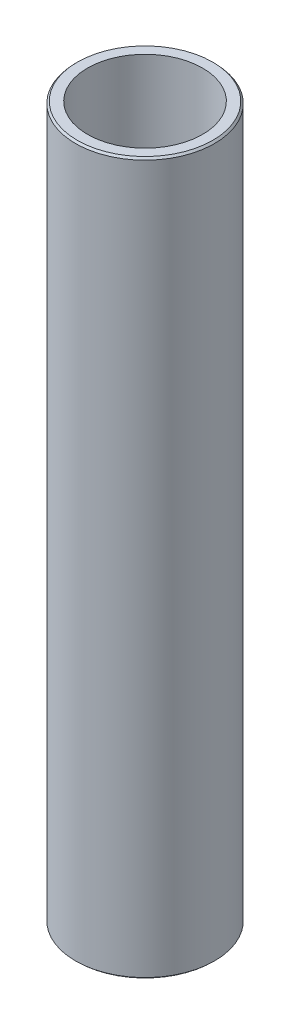
ISO-10303-21;
HEADER;
FILE_DESCRIPTION(('STEP AP214'),'2;1');
FILE_NAME('part.step','',(''),(''),'','','');
FILE_SCHEMA(('AUTOMOTIVE_DESIGN { 1 0 10303 214 1 1 1 1 }'));
ENDSEC;
DATA;
#1=APPLICATION_CONTEXT('core data for automotive mechanical design processes');
#2=APPLICATION_PROTOCOL_DEFINITION('international standard','automotive_design',2000,#1);
#3=PRODUCT_CONTEXT('',#1,'mechanical');
#4=PRODUCT('Part','Part','',(#3));
#5=PRODUCT_RELATED_PRODUCT_CATEGORY('part','',(#4));
#6=PRODUCT_DEFINITION_FORMATION('','',#4);
#7=PRODUCT_DEFINITION_CONTEXT('part definition',#1,'design');
#8=PRODUCT_DEFINITION('design','',#6,#7);
#9=PRODUCT_DEFINITION_SHAPE('','',#8);
#10=(LENGTH_UNIT() NAMED_UNIT(*) SI_UNIT(.MILLI.,.METRE.));
#11=(NAMED_UNIT(*) PLANE_ANGLE_UNIT() SI_UNIT($,.RADIAN.));
#12=(NAMED_UNIT(*) SI_UNIT($,.STERADIAN.) SOLID_ANGLE_UNIT());
#13=UNCERTAINTY_MEASURE_WITH_UNIT(LENGTH_MEASURE(1.E-05),#10,'distance_accuracy_value','');
#14=(GEOMETRIC_REPRESENTATION_CONTEXT(3) GLOBAL_UNCERTAINTY_ASSIGNED_CONTEXT((#13)) GLOBAL_UNIT_ASSIGNED_CONTEXT((#10,
#11,#12)) REPRESENTATION_CONTEXT('',''));
#15=CARTESIAN_POINT('',(0.,0.,0.));
#16=DIRECTION('',(0.,0.,1.));
#17=DIRECTION('',(1.,0.,0.));
#18=AXIS2_PLACEMENT_3D('',#15,#16,#17);
#19=CARTESIAN_POINT('',(0.,563.064663054393,0.));
#20=DIRECTION('',(0.,-1.,0.));
#21=DIRECTION('',(0.,0.,-1.));
#22=AXIS2_PLACEMENT_3D('',#19,#20,#21);
#23=CYLINDRICAL_SURFACE('',#22,55.);
#24=CARTESIAN_POINT('',(0.,561.534398512626,0.));
#25=DIRECTION('',(0.,1.,0.));
#26=DIRECTION('',(0.,0.,1.));
#27=AXIS2_PLACEMENT_3D('',#24,#25,#26);
#28=CIRCLE('',#27,55.);
#29=CARTESIAN_POINT('',(0.,561.534398512626,-55.));
#30=VERTEX_POINT('',#29);
#31=EDGE_CURVE('E50',#30,#30,#28,.F.);
#32=CARTESIAN_POINT('',(0.,1.38551752652205,0.));
#33=DIRECTION('',(0.,1.,0.));
#34=DIRECTION('',(0.,0.,1.));
#35=AXIS2_PLACEMENT_3D('',#32,#33,#34);
#36=CIRCLE('',#35,55.);
#37=CARTESIAN_POINT('',(0.,1.38551752652194,-55.));
#38=VERTEX_POINT('',#37);
#39=EDGE_CURVE('E51',#38,#38,#36,.T.);
#40=CARTESIAN_POINT('',(0.,561.534398512626,-55.));
#41=CARTESIAN_POINT('',(0.,555.699514335688,-55.));
#42=CARTESIAN_POINT('',(0.,549.864630158749,-55.));
#43=CARTESIAN_POINT('',(0.,538.194861804872,-55.));
#44=CARTESIAN_POINT('',(0.,532.359977627933,-55.));
#45=CARTESIAN_POINT('',(0.,520.690209274056,-55.));
#46=CARTESIAN_POINT('',(0.,514.855325097118,-55.));
#47=CARTESIAN_POINT('',(0.,503.185556743241,-55.));
#48=CARTESIAN_POINT('',(0.,497.350672566302,-55.));
#49=CARTESIAN_POINT('',(0.,485.680904212425,-55.));
#50=CARTESIAN_POINT('',(0.,479.846020035486,-55.));
#51=CARTESIAN_POINT('',(0.,468.176251681609,-55.));
#52=CARTESIAN_POINT('',(0.,462.34136750467,-55.));
#53=CARTESIAN_POINT('',(0.,450.671599150793,-55.));
#54=CARTESIAN_POINT('',(0.,444.836714973855,-55.));
#55=CARTESIAN_POINT('',(0.,433.166946619977,-55.));
#56=CARTESIAN_POINT('',(0.,427.332062443039,-55.));
#57=CARTESIAN_POINT('',(0.,415.662294089162,-55.));
#58=CARTESIAN_POINT('',(0.,409.827409912223,-55.));
#59=CARTESIAN_POINT('',(0.,398.157641558346,-55.));
#60=CARTESIAN_POINT('',(0.,392.322757381407,-55.));
#61=CARTESIAN_POINT('',(0.,380.65298902753,-55.));
#62=CARTESIAN_POINT('',(0.,374.818104850592,-55.));
#63=CARTESIAN_POINT('',(0.,363.148336496714,-55.));
#64=CARTESIAN_POINT('',(0.,357.313452319776,-55.));
#65=CARTESIAN_POINT('',(0.,345.643683965899,-55.));
#66=CARTESIAN_POINT('',(0.,339.80879978896,-55.));
#67=CARTESIAN_POINT('',(0.,328.139031435083,-55.));
#68=CARTESIAN_POINT('',(0.,322.304147258144,-55.));
#69=CARTESIAN_POINT('',(0.,310.634378904267,-55.));
#70=CARTESIAN_POINT('',(0.,304.799494727329,-55.));
#71=CARTESIAN_POINT('',(0.,293.129726373451,-55.));
#72=CARTESIAN_POINT('',(0.,287.294842196513,-55.));
#73=CARTESIAN_POINT('',(0.,275.625073842636,-55.));
#74=CARTESIAN_POINT('',(0.,269.790189665697,-55.));
#75=CARTESIAN_POINT('',(0.,258.12042131182,-55.));
#76=CARTESIAN_POINT('',(0.,252.285537134881,-55.));
#77=CARTESIAN_POINT('',(0.,240.615768781004,-55.));
#78=CARTESIAN_POINT('',(0.,234.780884604065,-55.));
#79=CARTESIAN_POINT('',(0.,223.111116250188,-55.));
#80=CARTESIAN_POINT('',(0.,217.27623207325,-55.));
#81=CARTESIAN_POINT('',(0.,205.606463719373,-55.));
#82=CARTESIAN_POINT('',(0.,199.771579542434,-55.));
#83=CARTESIAN_POINT('',(0.,188.101811188557,-55.));
#84=CARTESIAN_POINT('',(0.,182.266927011618,-55.));
#85=CARTESIAN_POINT('',(0.,170.597158657741,-55.));
#86=CARTESIAN_POINT('',(0.,164.762274480802,-55.));
#87=CARTESIAN_POINT('',(0.,153.092506126925,-55.));
#88=CARTESIAN_POINT('',(0.,147.257621949987,-55.));
#89=CARTESIAN_POINT('',(0.,135.587853596109,-55.));
#90=CARTESIAN_POINT('',(0.,129.752969419171,-55.));
#91=CARTESIAN_POINT('',(0.,118.083201065294,-55.));
#92=CARTESIAN_POINT('',(0.,112.248316888355,-55.));
#93=CARTESIAN_POINT('',(0.,100.578548534478,-55.));
#94=CARTESIAN_POINT('',(0.,94.7436643575393,-55.));
#95=CARTESIAN_POINT('',(0.,83.0738960036622,-55.));
#96=CARTESIAN_POINT('',(0.,77.2390118267236,-55.));
#97=CARTESIAN_POINT('',(0.,65.5692434728464,-55.));
#98=CARTESIAN_POINT('',(0.,59.7343592959078,-55.));
#99=CARTESIAN_POINT('',(0.,48.0645909420306,-55.));
#100=CARTESIAN_POINT('',(0.,42.2297067650921,-55.));
#101=CARTESIAN_POINT('',(0.,30.5599384112149,-55.));
#102=CARTESIAN_POINT('',(0.,24.7250542342763,-55.));
#103=CARTESIAN_POINT('',(0.,13.0552858803991,-55.));
#104=CARTESIAN_POINT('',(0.,7.22040170346054,-55.));
#105=CARTESIAN_POINT('',(0.,1.38551752652194,-55.));
#106=B_SPLINE_CURVE_WITH_KNOTS('',3,(#40,#41,#42,#43,#44,#45,#46,#47,#48,#49,#50,#51,#52,#53,
#54,#55,#56,#57,#58,#59,#60,#61,#62,#63,#64,#65,#66,#67,#68,#69,#70,#71,#72,#73,#74,#75,#76,#77,
#78,#79,#80,#81,#82,#83,#84,#85,#86,#87,#88,#89,#90,#91,#92,#93,#94,#95,#96,#97,#98,#99,#100,
#101,#102,#103,#104,#105),.UNSPECIFIED.,.F.,.F.,(4,2,2,2,2,2,2,2,2,2,2,2,2,2,2,2,2,2,2,2,2,2,2,
2,2,2,2,2,2,2,2,2,4),(0.,17.5046525308157,35.0093050616315,52.5139575924473,70.018610123263,
87.5232626540787,105.027915184895,122.53256771571,140.037220246526,157.541872777342,
175.046525308158,192.551177838973,210.055830369789,227.560482900605,245.065135431421,
262.569787962236,280.074440493052,297.579093023868,315.083745554684,332.588398085499,
350.093050616315,367.597703147131,385.102355677947,402.607008208763,420.111660739578,
437.616313270394,455.12096580121,472.625618332026,490.130270862841,507.634923393657,
525.139575924473,542.644228455289,560.148880986104),.UNSPECIFIED.);
#107=EDGE_CURVE('BSEAM39',#30,#38,#106,.T.);
#108=ORIENTED_EDGE('',*,*,#31,.T.);
#109=ORIENTED_EDGE('',*,*,#39,.T.);
#110=ORIENTED_EDGE('',*,*,#107,.T.);
#111=ORIENTED_EDGE('',*,*,#107,.F.);
#112=EDGE_LOOP('',(#108,#110,#109,#111));
#113=FACE_BOUND('',#112,.T.);
#114=ADVANCED_FACE('F39',(#113),#23,.T.);
#115=CARTESIAN_POINT('',(0.,563.064663054393,0.));
#116=DIRECTION('',(0.,1.,0.));
#117=DIRECTION('',(0.,0.,1.));
#118=AXIS2_PLACEMENT_3D('',#115,#116,#117);
#119=PLANE('',#118);
#120=CARTESIAN_POINT('',(0.,563.064663054393,0.));
#121=DIRECTION('',(0.,1.,0.));
#122=DIRECTION('',(0.,0.,1.));
#123=AXIS2_PLACEMENT_3D('',#120,#121,#122);
#124=CIRCLE('',#123,53.6144824734787);
#125=CARTESIAN_POINT('',(0.,563.064663054393,53.6144824734787));
#126=VERTEX_POINT('',#125);
#127=EDGE_CURVE('E54',#126,#126,#124,.T.);
#128=ORIENTED_EDGE('',*,*,#127,.T.);
#129=EDGE_LOOP('',(#128));
#130=FACE_BOUND('',#129,.T.);
#131=CARTESIAN_POINT('',(0.,563.064663054393,0.));
#132=DIRECTION('',(0.,1.,0.));
#133=DIRECTION('',(0.,0.,1.));
#134=AXIS2_PLACEMENT_3D('',#131,#132,#133);
#135=CIRCLE('',#134,45.524548650965);
#136=CARTESIAN_POINT('',(0.,563.064663054393,-45.524548650965));
#137=VERTEX_POINT('',#136);
#138=EDGE_CURVE('E58',#137,#137,#135,.T.);
#139=ORIENTED_EDGE('',*,*,#138,.F.);
#140=EDGE_LOOP('',(#139));
#141=FACE_BOUND('',#140,.T.);
#142=ADVANCED_FACE('F69',(#130,#141),#119,.T.);
#143=CARTESIAN_POINT('',(0.,0.,0.));
#144=DIRECTION('',(0.,1.,0.));
#145=DIRECTION('',(0.,0.,1.));
#146=AXIS2_PLACEMENT_3D('',#143,#144,#145);
#147=PLANE('',#146);
#148=CARTESIAN_POINT('',(0.,0.,0.));
#149=DIRECTION('',(0.,1.,0.));
#150=DIRECTION('',(0.,0.,1.));
#151=AXIS2_PLACEMENT_3D('',#148,#149,#150);
#152=CIRCLE('',#151,53.4697354582327);
#153=CARTESIAN_POINT('',(0.,0.,53.4697354582327));
#154=VERTEX_POINT('',#153);
#155=EDGE_CURVE('E10',#154,#154,#152,.F.);
#156=ORIENTED_EDGE('',*,*,#155,.T.);
#157=EDGE_LOOP('',(#156));
#158=FACE_BOUND('',#157,.T.);
#159=CARTESIAN_POINT('',(0.,0.,0.));
#160=DIRECTION('',(0.,1.,0.));
#161=DIRECTION('',(0.,0.,1.));
#162=AXIS2_PLACEMENT_3D('',#159,#160,#161);
#163=CIRCLE('',#162,45.524548650965);
#164=CARTESIAN_POINT('',(0.,-1.11022302462516E-13,-45.524548650965));
#165=VERTEX_POINT('',#164);
#166=EDGE_CURVE('E63',#165,#165,#163,.T.);
#167=ORIENTED_EDGE('',*,*,#166,.T.);
#168=EDGE_LOOP('',(#167));
#169=FACE_BOUND('',#168,.T.);
#170=ADVANCED_FACE('F75',(#158,#169),#147,.F.);
#171=CARTESIAN_POINT('',(0.,563.064663054393,0.));
#172=DIRECTION('',(0.,-1.,0.));
#173=DIRECTION('',(0.,0.,-1.));
#174=AXIS2_PLACEMENT_3D('',#171,#172,#173);
#175=CYLINDRICAL_SURFACE('',#174,45.524548650965);
#176=CARTESIAN_POINT('',(0.,563.064663054393,-45.524548650965));
#177=CARTESIAN_POINT('',(0.,557.199406147576,-45.524548650965));
#178=CARTESIAN_POINT('',(0.,551.33414924076,-45.524548650965));
#179=CARTESIAN_POINT('',(0.,539.603635427127,-45.524548650965));
#180=CARTESIAN_POINT('',(0.,533.73837852031,-45.524548650965));
#181=CARTESIAN_POINT('',(0.,522.007864706677,-45.524548650965));
#182=CARTESIAN_POINT('',(0.,516.14260779986,-45.524548650965));
#183=CARTESIAN_POINT('',(0.,504.412093986227,-45.524548650965));
#184=CARTESIAN_POINT('',(0.,498.54683707941,-45.524548650965));
#185=CARTESIAN_POINT('',(0.,486.816323265777,-45.524548650965));
#186=CARTESIAN_POINT('',(0.,480.951066358961,-45.524548650965));
#187=CARTESIAN_POINT('',(0.,469.220552545327,-45.524548650965));
#188=CARTESIAN_POINT('',(0.,463.355295638511,-45.524548650965));
#189=CARTESIAN_POINT('',(0.,451.624781824878,-45.524548650965));
#190=CARTESIAN_POINT('',(0.,445.759524918061,-45.524548650965));
#191=CARTESIAN_POINT('',(0.,434.029011104428,-45.524548650965));
#192=CARTESIAN_POINT('',(0.,428.163754197611,-45.524548650965));
#193=CARTESIAN_POINT('',(0.,416.433240383978,-45.524548650965));
#194=CARTESIAN_POINT('',(0.,410.567983477161,-45.524548650965));
#195=CARTESIAN_POINT('',(0.,398.837469663528,-45.524548650965));
#196=CARTESIAN_POINT('',(0.,392.972212756712,-45.524548650965));
#197=CARTESIAN_POINT('',(0.,381.241698943078,-45.524548650965));
#198=CARTESIAN_POINT('',(0.,375.376442036262,-45.524548650965));
#199=CARTESIAN_POINT('',(0.,363.645928222629,-45.524548650965));
#200=CARTESIAN_POINT('',(0.,357.780671315812,-45.524548650965));
#201=CARTESIAN_POINT('',(0.,346.050157502179,-45.524548650965));
#202=CARTESIAN_POINT('',(0.,340.184900595362,-45.524548650965));
#203=CARTESIAN_POINT('',(0.,328.454386781729,-45.524548650965));
#204=CARTESIAN_POINT('',(0.,322.589129874912,-45.524548650965));
#205=CARTESIAN_POINT('',(0.,310.858616061279,-45.524548650965));
#206=CARTESIAN_POINT('',(0.,304.993359154463,-45.524548650965));
#207=CARTESIAN_POINT('',(0.,293.26284534083,-45.524548650965));
#208=CARTESIAN_POINT('',(0.,287.397588434013,-45.524548650965));
#209=CARTESIAN_POINT('',(0.,275.66707462038,-45.524548650965));
#210=CARTESIAN_POINT('',(0.,269.801817713563,-45.524548650965));
#211=CARTESIAN_POINT('',(0.,258.07130389993,-45.524548650965));
#212=CARTESIAN_POINT('',(0.,252.206046993113,-45.524548650965));
#213=CARTESIAN_POINT('',(0.,240.47553317948,-45.524548650965));
#214=CARTESIAN_POINT('',(0.,234.610276272664,-45.524548650965));
#215=CARTESIAN_POINT('',(0.,222.87976245903,-45.524548650965));
#216=CARTESIAN_POINT('',(0.,217.014505552214,-45.524548650965));
#217=CARTESIAN_POINT('',(0.,205.283991738581,-45.524548650965));
#218=CARTESIAN_POINT('',(0.,199.418734831764,-45.524548650965));
#219=CARTESIAN_POINT('',(0.,187.688221018131,-45.524548650965));
#220=CARTESIAN_POINT('',(0.,181.822964111314,-45.524548650965));
#221=CARTESIAN_POINT('',(0.,170.092450297681,-45.524548650965));
#222=CARTESIAN_POINT('',(0.,164.227193390864,-45.524548650965));
#223=CARTESIAN_POINT('',(0.,152.496679577231,-45.524548650965));
#224=CARTESIAN_POINT('',(0.,146.631422670415,-45.524548650965));
#225=CARTESIAN_POINT('',(0.,134.900908856781,-45.524548650965));
#226=CARTESIAN_POINT('',(0.,129.035651949965,-45.524548650965));
#227=CARTESIAN_POINT('',(0.,117.305138136332,-45.524548650965));
#228=CARTESIAN_POINT('',(0.,111.439881229515,-45.524548650965));
#229=CARTESIAN_POINT('',(0.,99.7093674158819,-45.524548650965));
#230=CARTESIAN_POINT('',(0.,93.8441105090653,-45.524548650965));
#231=CARTESIAN_POINT('',(0.,82.1135966954321,-45.524548650965));
#232=CARTESIAN_POINT('',(0.,76.2483397886156,-45.524548650965));
#233=CARTESIAN_POINT('',(0.,64.5178259749824,-45.524548650965));
#234=CARTESIAN_POINT('',(0.,58.6525690681658,-45.524548650965));
#235=CARTESIAN_POINT('',(0.,46.9220552545326,-45.524548650965));
#236=CARTESIAN_POINT('',(0.,41.056798347716,-45.524548650965));
#237=CARTESIAN_POINT('',(0.,29.3262845340829,-45.524548650965));
#238=CARTESIAN_POINT('',(0.,23.4610276272663,-45.524548650965));
#239=CARTESIAN_POINT('',(0.,11.7305138136331,-45.524548650965));
#240=CARTESIAN_POINT('',(0.,5.8652569068165,-45.524548650965));
#241=CARTESIAN_POINT('',(0.,-1.11022302462516E-13,-45.524548650965));
#242=B_SPLINE_CURVE_WITH_KNOTS('',3,(#176,#177,#178,#179,#180,#181,#182,#183,#184,#185,#186,
#187,#188,#189,#190,#191,#192,#193,#194,#195,#196,#197,#198,#199,#200,#201,#202,#203,#204,#205,
#206,#207,#208,#209,#210,#211,#212,#213,#214,#215,#216,#217,#218,#219,#220,#221,#222,#223,#224,
#225,#226,#227,#228,#229,#230,#231,#232,#233,#234,#235,#236,#237,#238,#239,#240,#241),
.UNSPECIFIED.,.F.,.F.,(4,2,2,2,2,2,2,2,2,2,2,2,2,2,2,2,2,2,2,2,2,2,2,2,2,2,2,2,2,2,2,2,4),(0.,
17.5957707204498,35.1915414408996,52.7873121613494,70.3830828817992,87.978853602249,
105.574624322699,123.170395043149,140.766165763598,158.361936484048,175.957707204498,
193.553477924948,211.149248645397,228.745019365847,246.340790086297,263.936560806747,
281.532331527197,299.128102247646,316.723872968096,334.319643688546,351.915414408996,
369.511185129446,387.106955849895,404.702726570345,422.298497290795,439.894268011245,
457.490038731694,475.085809452144,492.681580172594,510.277350893044,527.873121613493,
545.468892333943,563.064663054393),.UNSPECIFIED.);
#243=EDGE_CURVE('BSEAM70',#137,#165,#242,.T.);
#244=ORIENTED_EDGE('',*,*,#138,.T.);
#245=ORIENTED_EDGE('',*,*,#166,.F.);
#246=ORIENTED_EDGE('',*,*,#243,.T.);
#247=ORIENTED_EDGE('',*,*,#243,.F.);
#248=EDGE_LOOP('',(#244,#246,#245,#247));
#249=FACE_BOUND('',#248,.T.);
#250=ADVANCED_FACE('F70',(#249),#175,.F.);
#251=CARTESIAN_POINT('',(0.,563.064663054393,0.));
#252=DIRECTION('',(0.,-1.,0.));
#253=DIRECTION('',(0.,0.,-1.));
#254=AXIS2_PLACEMENT_3D('',#251,#252,#253);
#255=CONICAL_SURFACE('',#254,53.6144824734787,0.735796278521179);
#256=ORIENTED_EDGE('',*,*,#31,.F.);
#257=EDGE_LOOP('',(#256));
#258=FACE_BOUND('',#257,.T.);
#259=ORIENTED_EDGE('',*,*,#127,.F.);
#260=EDGE_LOOP('',(#259));
#261=FACE_BOUND('',#260,.T.);
#262=ADVANCED_FACE('F81',(#258,#261),#255,.T.);
#263=CARTESIAN_POINT('',(0.,1.38551752652205,0.));
#264=DIRECTION('',(0.,1.,0.));
#265=DIRECTION('',(0.,0.,1.));
#266=AXIS2_PLACEMENT_3D('',#263,#264,#265);
#267=CONICAL_SURFACE('',#266,55.,0.835000048273701);
#268=ORIENTED_EDGE('',*,*,#155,.F.);
#269=EDGE_LOOP('',(#268));
#270=FACE_BOUND('',#269,.T.);
#271=ORIENTED_EDGE('',*,*,#39,.F.);
#272=EDGE_LOOP('',(#271));
#273=FACE_BOUND('',#272,.T.);
#274=ADVANCED_FACE('F45',(#270,#273),#267,.T.);
#275=CLOSED_SHELL('',(#114,#142,#170,#250,#262,#274));
#276=MANIFOLD_SOLID_BREP('B2',#275);
#277=ADVANCED_BREP_SHAPE_REPRESENTATION('',(#18,#276),#14);
#278=SHAPE_DEFINITION_REPRESENTATION(#9,#277);
ENDSEC;
END-ISO-10303-21;
